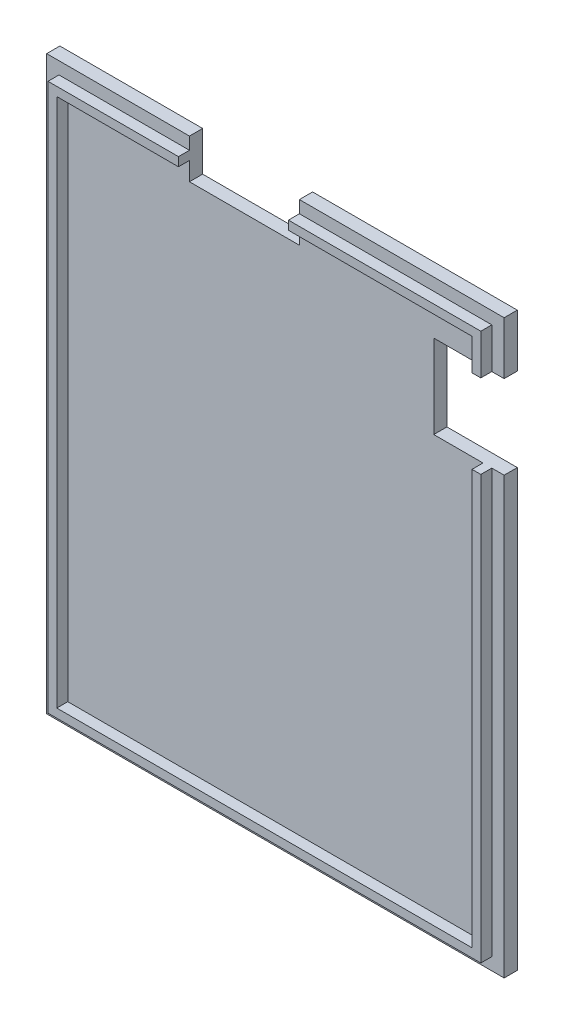
ISO-10303-21;
HEADER;
FILE_DESCRIPTION(('STEP AP214'),'2;1');
FILE_NAME('part.step','',(''),(''),'','','');
FILE_SCHEMA(('AUTOMOTIVE_DESIGN { 1 0 10303 214 1 1 1 1 }'));
ENDSEC;
DATA;
#1=APPLICATION_CONTEXT('core data for automotive mechanical design processes');
#2=APPLICATION_PROTOCOL_DEFINITION('international standard','automotive_design',2000,#1);
#3=PRODUCT_CONTEXT('',#1,'mechanical');
#4=PRODUCT('Part','Part','',(#3));
#5=PRODUCT_RELATED_PRODUCT_CATEGORY('part','',(#4));
#6=PRODUCT_DEFINITION_FORMATION('','',#4);
#7=PRODUCT_DEFINITION_CONTEXT('part definition',#1,'design');
#8=PRODUCT_DEFINITION('design','',#6,#7);
#9=PRODUCT_DEFINITION_SHAPE('','',#8);
#10=(LENGTH_UNIT() NAMED_UNIT(*) SI_UNIT(.MILLI.,.METRE.));
#11=(NAMED_UNIT(*) PLANE_ANGLE_UNIT() SI_UNIT($,.RADIAN.));
#12=(NAMED_UNIT(*) SI_UNIT($,.STERADIAN.) SOLID_ANGLE_UNIT());
#13=UNCERTAINTY_MEASURE_WITH_UNIT(LENGTH_MEASURE(1.E-05),#10,'distance_accuracy_value','');
#14=(GEOMETRIC_REPRESENTATION_CONTEXT(3) GLOBAL_UNCERTAINTY_ASSIGNED_CONTEXT((#13)) GLOBAL_UNIT_ASSIGNED_CONTEXT((#10,
#11,#12)) REPRESENTATION_CONTEXT('',''));
#15=CARTESIAN_POINT('',(0.,0.,0.));
#16=DIRECTION('',(0.,0.,1.));
#17=DIRECTION('',(1.,0.,0.));
#18=AXIS2_PLACEMENT_3D('',#15,#16,#17);
#19=CARTESIAN_POINT('',(0.,0.,3.));
#20=DIRECTION('',(0.,0.,1.));
#21=DIRECTION('',(1.,0.,0.));
#22=AXIS2_PLACEMENT_3D('',#19,#20,#21);
#23=PLANE('',#22);
#24=DIRECTION('',(-1.,0.,0.));
#25=VECTOR('',#24,1.);
#26=CARTESIAN_POINT('',(0.,53.,3.));
#27=LINE('',#26,#25);
#28=CARTESIAN_POINT('',(52.,53.,3.));
#29=VERTEX_POINT('',#28);
#30=CARTESIAN_POINT('',(49.2,53.,3.));
#31=VERTEX_POINT('',#30);
#32=EDGE_CURVE('E314',#29,#31,#27,.T.);
#33=ORIENTED_EDGE('',*,*,#32,.F.);
#34=DIRECTION('',(0.,1.,0.));
#35=VECTOR('',#34,1.);
#36=CARTESIAN_POINT('',(52.,65.,3.));
#37=LINE('',#36,#35);
#38=CARTESIAN_POINT('',(52.,65.,3.));
#39=VERTEX_POINT('',#38);
#40=EDGE_CURVE('E261',#29,#39,#37,.T.);
#41=ORIENTED_EDGE('',*,*,#40,.T.);
#42=DIRECTION('',(-1.,0.,0.));
#43=VECTOR('',#42,1.);
#44=CARTESIAN_POINT('',(-52.,65.,3.));
#45=LINE('',#44,#43);
#46=CARTESIAN_POINT('',(5.45881259509573,65.,3.));
#47=VERTEX_POINT('',#46);
#48=EDGE_CURVE('E389',#39,#47,#45,.T.);
#49=ORIENTED_EDGE('',*,*,#48,.T.);
#50=DIRECTION('',(0.,1.,0.));
#51=VECTOR('',#50,1.);
#52=CARTESIAN_POINT('',(5.45881259509572,0.,3.));
#53=LINE('',#52,#51);
#54=CARTESIAN_POINT('',(5.45881259509573,62.2,3.));
#55=VERTEX_POINT('',#54);
#56=EDGE_CURVE('E427',#55,#47,#53,.T.);
#57=ORIENTED_EDGE('',*,*,#56,.F.);
#58=DIRECTION('',(-1.,0.,0.));
#59=VECTOR('',#58,1.);
#60=CARTESIAN_POINT('',(0.,62.2,3.));
#61=LINE('',#60,#59);
#62=CARTESIAN_POINT('',(49.2,62.2,3.));
#63=VERTEX_POINT('',#62);
#64=EDGE_CURVE('E321',#63,#55,#61,.T.);
#65=ORIENTED_EDGE('',*,*,#64,.F.);
#66=DIRECTION('',(0.,1.,0.));
#67=VECTOR('',#66,1.);
#68=CARTESIAN_POINT('',(49.2,0.,3.));
#69=LINE('',#68,#67);
#70=EDGE_CURVE('E358',#31,#63,#69,.T.);
#71=ORIENTED_EDGE('',*,*,#70,.F.);
#72=EDGE_LOOP('',(#33,#41,#49,#57,#65,#71));
#73=FACE_BOUND('',#72,.T.);
#74=ADVANCED_FACE('F37',(#73),#23,.T.);
#75=CARTESIAN_POINT('',(52.,65.,3.));
#76=DIRECTION('',(-1.,0.,0.));
#77=DIRECTION('',(0.,-1.,0.));
#78=AXIS2_PLACEMENT_3D('',#75,#76,#77);
#79=PLANE('',#78);
#80=ORIENTED_EDGE('',*,*,#40,.F.);
#81=DIRECTION('',(0.,0.,-1.));
#82=VECTOR('',#81,1.);
#83=CARTESIAN_POINT('',(52.,53.,5.5));
#84=LINE('',#83,#82);
#85=CARTESIAN_POINT('',(52.,53.,0.));
#86=VERTEX_POINT('',#85);
#87=EDGE_CURVE('E424',#29,#86,#84,.T.);
#88=ORIENTED_EDGE('',*,*,#87,.T.);
#89=DIRECTION('',(0.,1.,0.));
#90=VECTOR('',#89,1.);
#91=CARTESIAN_POINT('',(52.,65.,0.));
#92=LINE('',#91,#90);
#93=CARTESIAN_POINT('',(52.,65.,0.));
#94=VERTEX_POINT('',#93);
#95=EDGE_CURVE('E247',#86,#94,#92,.T.);
#96=ORIENTED_EDGE('',*,*,#95,.T.);
#97=DIRECTION('',(0.,0.,-1.));
#98=VECTOR('',#97,1.);
#99=CARTESIAN_POINT('',(52.,65.,3.));
#100=LINE('',#99,#98);
#101=EDGE_CURVE('E269',#39,#94,#100,.T.);
#102=ORIENTED_EDGE('',*,*,#101,.F.);
#103=EDGE_LOOP('',(#80,#88,#96,#102));
#104=FACE_BOUND('',#103,.T.);
#105=ADVANCED_FACE('F500',(#104),#79,.F.);
#106=CARTESIAN_POINT('',(-52.,65.,3.));
#107=DIRECTION('',(0.,-1.,0.));
#108=DIRECTION('',(0.,0.,-1.));
#109=AXIS2_PLACEMENT_3D('',#106,#107,#108);
#110=PLANE('',#109);
#111=CARTESIAN_POINT('',(-19.5411874049043,65.,3.));
#112=VERTEX_POINT('',#111);
#113=CARTESIAN_POINT('',(-52.,65.,3.));
#114=VERTEX_POINT('',#113);
#115=EDGE_CURVE('E388',#112,#114,#45,.T.);
#116=ORIENTED_EDGE('',*,*,#115,.F.);
#117=DIRECTION('',(0.,0.,-1.));
#118=VECTOR('',#117,1.);
#119=CARTESIAN_POINT('',(-19.5411874049043,65.,5.5));
#120=LINE('',#119,#118);
#121=CARTESIAN_POINT('',(-19.5411874049043,65.,0.));
#122=VERTEX_POINT('',#121);
#123=EDGE_CURVE('E409',#112,#122,#120,.T.);
#124=ORIENTED_EDGE('',*,*,#123,.T.);
#125=DIRECTION('',(-1.,0.,0.));
#126=VECTOR('',#125,1.);
#127=CARTESIAN_POINT('',(-52.,65.,0.));
#128=LINE('',#127,#126);
#129=CARTESIAN_POINT('',(-52.,65.,0.));
#130=VERTEX_POINT('',#129);
#131=EDGE_CURVE('E246',#122,#130,#128,.T.);
#132=ORIENTED_EDGE('',*,*,#131,.T.);
#133=DIRECTION('',(0.,0.,-1.));
#134=VECTOR('',#133,1.);
#135=CARTESIAN_POINT('',(-52.,65.,3.));
#136=LINE('',#135,#134);
#137=EDGE_CURVE('E266',#114,#130,#136,.T.);
#138=ORIENTED_EDGE('',*,*,#137,.F.);
#139=EDGE_LOOP('',(#116,#124,#132,#138));
#140=FACE_BOUND('',#139,.T.);
#141=ADVANCED_FACE('F407',(#140),#110,.F.);
#142=CARTESIAN_POINT('',(49.2,0.,5.5));
#143=DIRECTION('',(-1.,0.,0.));
#144=DIRECTION('',(0.,-1.,0.));
#145=AXIS2_PLACEMENT_3D('',#142,#143,#144);
#146=PLANE('',#145);
#147=DIRECTION('',(0.,1.,0.));
#148=VECTOR('',#147,1.);
#149=CARTESIAN_POINT('',(49.2,0.,5.5));
#150=LINE('',#149,#148);
#151=CARTESIAN_POINT('',(49.2,53.,5.5));
#152=VERTEX_POINT('',#151);
#153=CARTESIAN_POINT('',(49.2,62.2,5.5));
#154=VERTEX_POINT('',#153);
#155=EDGE_CURVE('E335',#152,#154,#150,.T.);
#156=ORIENTED_EDGE('',*,*,#155,.F.);
#157=DIRECTION('',(0.,0.,-1.));
#158=VECTOR('',#157,1.);
#159=CARTESIAN_POINT('',(49.2,53.,5.5));
#160=LINE('',#159,#158);
#161=EDGE_CURVE('E311',#152,#31,#160,.T.);
#162=ORIENTED_EDGE('',*,*,#161,.T.);
#163=ORIENTED_EDGE('',*,*,#70,.T.);
#164=DIRECTION('',(0.,0.,-1.));
#165=VECTOR('',#164,1.);
#166=CARTESIAN_POINT('',(49.2,62.2,5.5));
#167=LINE('',#166,#165);
#168=EDGE_CURVE('E368',#154,#63,#167,.T.);
#169=ORIENTED_EDGE('',*,*,#168,.F.);
#170=EDGE_LOOP('',(#156,#162,#163,#169));
#171=FACE_BOUND('',#170,.T.);
#172=ADVANCED_FACE('F523',(#171),#146,.F.);
#173=CARTESIAN_POINT('',(0.,60.2,5.5));
#174=DIRECTION('',(0.,-1.,0.));
#175=DIRECTION('',(0.,0.,-1.));
#176=AXIS2_PLACEMENT_3D('',#173,#174,#175);
#177=PLANE('',#176);
#178=DIRECTION('',(0.,0.,-1.));
#179=VECTOR('',#178,1.);
#180=CARTESIAN_POINT('',(-19.5411874049043,60.2,5.5));
#181=LINE('',#180,#179);
#182=CARTESIAN_POINT('',(-19.5411874049043,60.2,5.5));
#183=VERTEX_POINT('',#182);
#184=CARTESIAN_POINT('',(-19.5411874049043,60.2,3.));
#185=VERTEX_POINT('',#184);
#186=EDGE_CURVE('E429',#183,#185,#181,.T.);
#187=ORIENTED_EDGE('',*,*,#186,.F.);
#188=DIRECTION('',(-1.,0.,0.));
#189=VECTOR('',#188,1.);
#190=CARTESIAN_POINT('',(0.,60.2,5.5));
#191=LINE('',#190,#189);
#192=CARTESIAN_POINT('',(-47.2,60.2,5.5));
#193=VERTEX_POINT('',#192);
#194=EDGE_CURVE('E324',#183,#193,#191,.T.);
#195=ORIENTED_EDGE('',*,*,#194,.T.);
#196=DIRECTION('',(0.,0.,-1.));
#197=VECTOR('',#196,1.);
#198=CARTESIAN_POINT('',(-47.2,60.2,5.5));
#199=LINE('',#198,#197);
#200=CARTESIAN_POINT('',(-47.2,60.2,3.));
#201=VERTEX_POINT('',#200);
#202=EDGE_CURVE('E381',#193,#201,#199,.T.);
#203=ORIENTED_EDGE('',*,*,#202,.T.);
#204=DIRECTION('',(-1.,0.,0.));
#205=VECTOR('',#204,1.);
#206=CARTESIAN_POINT('',(0.,60.2,3.));
#207=LINE('',#206,#205);
#208=EDGE_CURVE('E347',#185,#201,#207,.T.);
#209=ORIENTED_EDGE('',*,*,#208,.F.);
#210=EDGE_LOOP('',(#187,#195,#203,#209));
#211=FACE_BOUND('',#210,.T.);
#212=ADVANCED_FACE('F552',(#211),#177,.T.);
#213=CARTESIAN_POINT('',(47.2,0.,5.5));
#214=DIRECTION('',(-1.,0.,0.));
#215=DIRECTION('',(0.,0.,1.));
#216=AXIS2_PLACEMENT_3D('',#213,#214,#215);
#217=PLANE('',#216);
#218=DIRECTION('',(0.,0.,-1.));
#219=VECTOR('',#218,1.);
#220=CARTESIAN_POINT('',(47.2,53.,5.5));
#221=LINE('',#220,#219);
#222=CARTESIAN_POINT('',(47.2,53.,5.5));
#223=VERTEX_POINT('',#222);
#224=CARTESIAN_POINT('',(47.2,53.,3.));
#225=VERTEX_POINT('',#224);
#226=EDGE_CURVE('E309',#223,#225,#221,.T.);
#227=ORIENTED_EDGE('',*,*,#226,.F.);
#228=DIRECTION('',(0.,1.,0.));
#229=VECTOR('',#228,1.);
#230=CARTESIAN_POINT('',(47.2,0.,5.5));
#231=LINE('',#230,#229);
#232=CARTESIAN_POINT('',(47.2,60.2,5.5));
#233=VERTEX_POINT('',#232);
#234=EDGE_CURVE('E328',#223,#233,#231,.T.);
#235=ORIENTED_EDGE('',*,*,#234,.T.);
#236=DIRECTION('',(0.,0.,-1.));
#237=VECTOR('',#236,1.);
#238=CARTESIAN_POINT('',(47.2,60.2,5.5));
#239=LINE('',#238,#237);
#240=CARTESIAN_POINT('',(47.2,60.2,3.));
#241=VERTEX_POINT('',#240);
#242=EDGE_CURVE('E378',#233,#241,#239,.T.);
#243=ORIENTED_EDGE('',*,*,#242,.T.);
#244=DIRECTION('',(0.,1.,0.));
#245=VECTOR('',#244,1.);
#246=CARTESIAN_POINT('',(47.2,0.,3.));
#247=LINE('',#246,#245);
#248=EDGE_CURVE('E351',#225,#241,#247,.T.);
#249=ORIENTED_EDGE('',*,*,#248,.F.);
#250=EDGE_LOOP('',(#227,#235,#243,#249));
#251=FACE_BOUND('',#250,.T.);
#252=ADVANCED_FACE('F548',(#251),#217,.T.);
#253=CARTESIAN_POINT('',(0.,62.2,5.5));
#254=DIRECTION('',(0.,-1.,0.));
#255=DIRECTION('',(0.,0.,-1.));
#256=AXIS2_PLACEMENT_3D('',#253,#254,#255);
#257=PLANE('',#256);
#258=DIRECTION('',(-1.,0.,0.));
#259=VECTOR('',#258,1.);
#260=CARTESIAN_POINT('',(0.,62.2,5.5));
#261=LINE('',#260,#259);
#262=CARTESIAN_POINT('',(-19.5411874049043,62.2,5.5));
#263=VERTEX_POINT('',#262);
#264=CARTESIAN_POINT('',(-49.2,62.2,5.5));
#265=VERTEX_POINT('',#264);
#266=EDGE_CURVE('E339',#263,#265,#261,.T.);
#267=ORIENTED_EDGE('',*,*,#266,.F.);
#268=DIRECTION('',(0.,0.,-1.));
#269=VECTOR('',#268,1.);
#270=CARTESIAN_POINT('',(-19.5411874049043,62.2,5.5));
#271=LINE('',#270,#269);
#272=CARTESIAN_POINT('',(-19.5411874049043,62.2,3.));
#273=VERTEX_POINT('',#272);
#274=EDGE_CURVE('E304',#263,#273,#271,.T.);
#275=ORIENTED_EDGE('',*,*,#274,.T.);
#276=CARTESIAN_POINT('',(-49.2,62.2,3.));
#277=VERTEX_POINT('',#276);
#278=EDGE_CURVE('E362',#273,#277,#61,.T.);
#279=ORIENTED_EDGE('',*,*,#278,.T.);
#280=DIRECTION('',(0.,0.,-1.));
#281=VECTOR('',#280,1.);
#282=CARTESIAN_POINT('',(-49.2,62.2,5.5));
#283=LINE('',#282,#281);
#284=EDGE_CURVE('E365',#265,#277,#283,.T.);
#285=ORIENTED_EDGE('',*,*,#284,.F.);
#286=EDGE_LOOP('',(#267,#275,#279,#285));
#287=FACE_BOUND('',#286,.T.);
#288=ADVANCED_FACE('F434',(#287),#257,.F.);
#289=CARTESIAN_POINT('',(0.,0.,5.5));
#290=DIRECTION('',(0.,0.,1.));
#291=DIRECTION('',(1.,0.,0.));
#292=AXIS2_PLACEMENT_3D('',#289,#290,#291);
#293=PLANE('',#292);
#294=DIRECTION('',(1.,0.,0.));
#295=VECTOR('',#294,1.);
#296=CARTESIAN_POINT('',(52.,53.,5.5));
#297=LINE('',#296,#295);
#298=EDGE_CURVE('E230',#223,#152,#297,.T.);
#299=ORIENTED_EDGE('',*,*,#298,.T.);
#300=ORIENTED_EDGE('',*,*,#155,.T.);
#301=CARTESIAN_POINT('',(5.45881259509573,62.2,5.5));
#302=VERTEX_POINT('',#301);
#303=EDGE_CURVE('E340',#154,#302,#261,.T.);
#304=ORIENTED_EDGE('',*,*,#303,.T.);
#305=DIRECTION('',(0.,-1.,0.));
#306=VECTOR('',#305,1.);
#307=CARTESIAN_POINT('',(5.45881259509573,65.,5.5));
#308=LINE('',#307,#306);
#309=CARTESIAN_POINT('',(5.45881259509573,60.2,5.5));
#310=VERTEX_POINT('',#309);
#311=EDGE_CURVE('E413',#302,#310,#308,.T.);
#312=ORIENTED_EDGE('',*,*,#311,.T.);
#313=EDGE_CURVE('E325',#233,#310,#191,.T.);
#314=ORIENTED_EDGE('',*,*,#313,.F.);
#315=ORIENTED_EDGE('',*,*,#234,.F.);
#316=EDGE_LOOP('',(#299,#300,#304,#312,#314,#315));
#317=FACE_BOUND('',#316,.T.);
#318=ADVANCED_FACE('F482',(#317),#293,.T.);
#319=DIRECTION('',(1.,0.,0.));
#320=VECTOR('',#319,1.);
#321=CARTESIAN_POINT('',(0.,34.,3.));
#322=LINE('',#321,#320);
#323=CARTESIAN_POINT('',(49.2,34.,3.));
#324=VERTEX_POINT('',#323);
#325=CARTESIAN_POINT('',(52.,34.,3.));
#326=VERTEX_POINT('',#325);
#327=EDGE_CURVE('E225',#324,#326,#322,.T.);
#328=ORIENTED_EDGE('',*,*,#327,.F.);
#329=CARTESIAN_POINT('',(49.2,-62.2,3.));
#330=VERTEX_POINT('',#329);
#331=EDGE_CURVE('E359',#330,#324,#69,.T.);
#332=ORIENTED_EDGE('',*,*,#331,.F.);
#333=DIRECTION('',(1.,0.,0.));
#334=VECTOR('',#333,1.);
#335=CARTESIAN_POINT('',(0.,-62.2,3.));
#336=LINE('',#335,#334);
#337=CARTESIAN_POINT('',(-49.2,-62.2,3.));
#338=VERTEX_POINT('',#337);
#339=EDGE_CURVE('E356',#338,#330,#336,.T.);
#340=ORIENTED_EDGE('',*,*,#339,.F.);
#341=DIRECTION('',(0.,-1.,0.));
#342=VECTOR('',#341,1.);
#343=CARTESIAN_POINT('',(-49.2,0.,3.));
#344=LINE('',#343,#342);
#345=EDGE_CURVE('E353',#277,#338,#344,.T.);
#346=ORIENTED_EDGE('',*,*,#345,.F.);
#347=ORIENTED_EDGE('',*,*,#278,.F.);
#348=DIRECTION('',(0.,-1.,0.));
#349=VECTOR('',#348,1.);
#350=CARTESIAN_POINT('',(-19.5411874049043,0.,3.));
#351=LINE('',#350,#349);
#352=EDGE_CURVE('E300',#112,#273,#351,.T.);
#353=ORIENTED_EDGE('',*,*,#352,.F.);
#354=ORIENTED_EDGE('',*,*,#115,.T.);
#355=DIRECTION('',(0.,-1.,0.));
#356=VECTOR('',#355,1.);
#357=CARTESIAN_POINT('',(-52.,65.,3.));
#358=LINE('',#357,#356);
#359=CARTESIAN_POINT('',(-52.,-65.,3.));
#360=VERTEX_POINT('',#359);
#361=EDGE_CURVE('E391',#114,#360,#358,.T.);
#362=ORIENTED_EDGE('',*,*,#361,.T.);
#363=DIRECTION('',(1.,0.,0.));
#364=VECTOR('',#363,1.);
#365=CARTESIAN_POINT('',(-52.,-65.,3.));
#366=LINE('',#365,#364);
#367=CARTESIAN_POINT('',(52.,-65.,3.));
#368=VERTEX_POINT('',#367);
#369=EDGE_CURVE('E253',#360,#368,#366,.T.);
#370=ORIENTED_EDGE('',*,*,#369,.T.);
#371=EDGE_CURVE('E386',#368,#326,#37,.T.);
#372=ORIENTED_EDGE('',*,*,#371,.T.);
#373=EDGE_LOOP('',(#328,#332,#340,#346,#347,#353,#354,#362,#370,#372));
#374=FACE_BOUND('',#373,.T.);
#375=ADVANCED_FACE('F396',(#374),#23,.T.);
#376=CARTESIAN_POINT('',(52.,-65.,0.));
#377=VERTEX_POINT('',#376);
#378=CARTESIAN_POINT('',(52.,34.,0.));
#379=VERTEX_POINT('',#378);
#380=EDGE_CURVE('E237',#377,#379,#92,.T.);
#381=ORIENTED_EDGE('',*,*,#380,.T.);
#382=DIRECTION('',(0.,0.,-1.));
#383=VECTOR('',#382,1.);
#384=CARTESIAN_POINT('',(52.,34.,5.5));
#385=LINE('',#384,#383);
#386=EDGE_CURVE('E219',#326,#379,#385,.T.);
#387=ORIENTED_EDGE('',*,*,#386,.F.);
#388=ORIENTED_EDGE('',*,*,#371,.F.);
#389=DIRECTION('',(0.,0.,-1.));
#390=VECTOR('',#389,1.);
#391=CARTESIAN_POINT('',(52.,-65.,3.));
#392=LINE('',#391,#390);
#393=EDGE_CURVE('E245',#368,#377,#392,.T.);
#394=ORIENTED_EDGE('',*,*,#393,.T.);
#395=EDGE_LOOP('',(#381,#387,#388,#394));
#396=FACE_BOUND('',#395,.T.);
#397=ADVANCED_FACE('F39',(#396),#79,.F.);
#398=CARTESIAN_POINT('',(5.45881259509573,65.,0.));
#399=VERTEX_POINT('',#398);
#400=EDGE_CURVE('E249',#94,#399,#128,.T.);
#401=ORIENTED_EDGE('',*,*,#400,.T.);
#402=DIRECTION('',(0.,0.,-1.));
#403=VECTOR('',#402,1.);
#404=CARTESIAN_POINT('',(5.45881259509573,65.,5.5));
#405=LINE('',#404,#403);
#406=EDGE_CURVE('E412',#47,#399,#405,.T.);
#407=ORIENTED_EDGE('',*,*,#406,.F.);
#408=ORIENTED_EDGE('',*,*,#48,.F.);
#409=ORIENTED_EDGE('',*,*,#101,.T.);
#410=EDGE_LOOP('',(#401,#407,#408,#409));
#411=FACE_BOUND('',#410,.T.);
#412=ADVANCED_FACE('F494',(#411),#110,.F.);
#413=CARTESIAN_POINT('',(-52.,65.,3.));
#414=DIRECTION('',(1.,0.,0.));
#415=DIRECTION('',(0.,1.,0.));
#416=AXIS2_PLACEMENT_3D('',#413,#414,#415);
#417=PLANE('',#416);
#418=DIRECTION('',(0.,-1.,0.));
#419=VECTOR('',#418,1.);
#420=CARTESIAN_POINT('',(-52.,65.,0.));
#421=LINE('',#420,#419);
#422=CARTESIAN_POINT('',(-52.,-65.,0.));
#423=VERTEX_POINT('',#422);
#424=EDGE_CURVE('E257',#130,#423,#421,.T.);
#425=ORIENTED_EDGE('',*,*,#424,.T.);
#426=DIRECTION('',(0.,0.,-1.));
#427=VECTOR('',#426,1.);
#428=CARTESIAN_POINT('',(-52.,-65.,3.));
#429=LINE('',#428,#427);
#430=EDGE_CURVE('E263',#360,#423,#429,.T.);
#431=ORIENTED_EDGE('',*,*,#430,.F.);
#432=ORIENTED_EDGE('',*,*,#361,.F.);
#433=ORIENTED_EDGE('',*,*,#137,.T.);
#434=EDGE_LOOP('',(#425,#431,#432,#433));
#435=FACE_BOUND('',#434,.T.);
#436=ADVANCED_FACE('F403',(#435),#417,.F.);
#437=CARTESIAN_POINT('',(-52.,-65.,3.));
#438=DIRECTION('',(0.,1.,0.));
#439=DIRECTION('',(0.,0.,1.));
#440=AXIS2_PLACEMENT_3D('',#437,#438,#439);
#441=PLANE('',#440);
#442=DIRECTION('',(1.,0.,0.));
#443=VECTOR('',#442,1.);
#444=CARTESIAN_POINT('',(-52.,-65.,0.));
#445=LINE('',#444,#443);
#446=EDGE_CURVE('E259',#423,#377,#445,.T.);
#447=ORIENTED_EDGE('',*,*,#446,.T.);
#448=ORIENTED_EDGE('',*,*,#393,.F.);
#449=ORIENTED_EDGE('',*,*,#369,.F.);
#450=ORIENTED_EDGE('',*,*,#430,.T.);
#451=EDGE_LOOP('',(#447,#448,#449,#450));
#452=FACE_BOUND('',#451,.T.);
#453=ADVANCED_FACE('F398',(#452),#441,.F.);
#454=CARTESIAN_POINT('',(0.,0.,0.));
#455=DIRECTION('',(0.,0.,1.));
#456=DIRECTION('',(1.,0.,0.));
#457=AXIS2_PLACEMENT_3D('',#454,#455,#456);
#458=PLANE('',#457);
#459=ORIENTED_EDGE('',*,*,#95,.F.);
#460=DIRECTION('',(1.,0.,0.));
#461=VECTOR('',#460,1.);
#462=CARTESIAN_POINT('',(52.,53.,0.));
#463=LINE('',#462,#461);
#464=CARTESIAN_POINT('',(36.,53.,0.));
#465=VERTEX_POINT('',#464);
#466=EDGE_CURVE('E496',#465,#86,#463,.T.);
#467=ORIENTED_EDGE('',*,*,#466,.F.);
#468=DIRECTION('',(0.,1.,0.));
#469=VECTOR('',#468,1.);
#470=CARTESIAN_POINT('',(36.,53.,0.));
#471=LINE('',#470,#469);
#472=CARTESIAN_POINT('',(36.,34.,0.));
#473=VERTEX_POINT('',#472);
#474=EDGE_CURVE('E240',#473,#465,#471,.T.);
#475=ORIENTED_EDGE('',*,*,#474,.F.);
#476=DIRECTION('',(-1.,0.,0.));
#477=VECTOR('',#476,1.);
#478=CARTESIAN_POINT('',(52.,34.,0.));
#479=LINE('',#478,#477);
#480=EDGE_CURVE('E222',#379,#473,#479,.T.);
#481=ORIENTED_EDGE('',*,*,#480,.F.);
#482=ORIENTED_EDGE('',*,*,#380,.F.);
#483=ORIENTED_EDGE('',*,*,#446,.F.);
#484=ORIENTED_EDGE('',*,*,#424,.F.);
#485=ORIENTED_EDGE('',*,*,#131,.F.);
#486=DIRECTION('',(0.,1.,0.));
#487=VECTOR('',#486,1.);
#488=CARTESIAN_POINT('',(-19.5411874049043,65.,0.));
#489=LINE('',#488,#487);
#490=CARTESIAN_POINT('',(-19.5411874049043,56.,0.));
#491=VERTEX_POINT('',#490);
#492=EDGE_CURVE('E457',#491,#122,#489,.T.);
#493=ORIENTED_EDGE('',*,*,#492,.F.);
#494=DIRECTION('',(-1.,0.,0.));
#495=VECTOR('',#494,1.);
#496=CARTESIAN_POINT('',(5.45881259509573,56.,0.));
#497=LINE('',#496,#495);
#498=CARTESIAN_POINT('',(5.45881259509573,56.,0.));
#499=VERTEX_POINT('',#498);
#500=EDGE_CURVE('E450',#499,#491,#497,.T.);
#501=ORIENTED_EDGE('',*,*,#500,.F.);
#502=DIRECTION('',(0.,-1.,0.));
#503=VECTOR('',#502,1.);
#504=CARTESIAN_POINT('',(5.45881259509573,65.,0.));
#505=LINE('',#504,#503);
#506=EDGE_CURVE('E453',#399,#499,#505,.T.);
#507=ORIENTED_EDGE('',*,*,#506,.F.);
#508=ORIENTED_EDGE('',*,*,#400,.F.);
#509=EDGE_LOOP('',(#459,#467,#475,#481,#482,#483,#484,#485,#493,#501,#507,#508));
#510=FACE_BOUND('',#509,.T.);
#511=ADVANCED_FACE('F235',(#510),#458,.F.);
#512=CARTESIAN_POINT('',(-49.2,0.,5.5));
#513=DIRECTION('',(1.,0.,0.));
#514=DIRECTION('',(0.,1.,0.));
#515=AXIS2_PLACEMENT_3D('',#512,#513,#514);
#516=PLANE('',#515);
#517=ORIENTED_EDGE('',*,*,#345,.T.);
#518=DIRECTION('',(0.,0.,-1.));
#519=VECTOR('',#518,1.);
#520=CARTESIAN_POINT('',(-49.2,-62.2,5.5));
#521=LINE('',#520,#519);
#522=CARTESIAN_POINT('',(-49.2,-62.2,5.5));
#523=VERTEX_POINT('',#522);
#524=EDGE_CURVE('E251',#523,#338,#521,.T.);
#525=ORIENTED_EDGE('',*,*,#524,.F.);
#526=DIRECTION('',(0.,-1.,0.));
#527=VECTOR('',#526,1.);
#528=CARTESIAN_POINT('',(-49.2,0.,5.5));
#529=LINE('',#528,#527);
#530=EDGE_CURVE('E330',#265,#523,#529,.T.);
#531=ORIENTED_EDGE('',*,*,#530,.F.);
#532=ORIENTED_EDGE('',*,*,#284,.T.);
#533=EDGE_LOOP('',(#517,#525,#531,#532));
#534=FACE_BOUND('',#533,.T.);
#535=ADVANCED_FACE('F442',(#534),#516,.F.);
#536=CARTESIAN_POINT('',(0.,-62.2,5.5));
#537=DIRECTION('',(0.,1.,0.));
#538=DIRECTION('',(0.,0.,1.));
#539=AXIS2_PLACEMENT_3D('',#536,#537,#538);
#540=PLANE('',#539);
#541=ORIENTED_EDGE('',*,*,#339,.T.);
#542=DIRECTION('',(0.,0.,-1.));
#543=VECTOR('',#542,1.);
#544=CARTESIAN_POINT('',(49.2,-62.2,5.5));
#545=LINE('',#544,#543);
#546=CARTESIAN_POINT('',(49.2,-62.2,5.5));
#547=VERTEX_POINT('',#546);
#548=EDGE_CURVE('E372',#547,#330,#545,.T.);
#549=ORIENTED_EDGE('',*,*,#548,.F.);
#550=DIRECTION('',(1.,0.,0.));
#551=VECTOR('',#550,1.);
#552=CARTESIAN_POINT('',(0.,-62.2,5.5));
#553=LINE('',#552,#551);
#554=EDGE_CURVE('E333',#523,#547,#553,.T.);
#555=ORIENTED_EDGE('',*,*,#554,.F.);
#556=ORIENTED_EDGE('',*,*,#524,.T.);
#557=EDGE_LOOP('',(#541,#549,#555,#556));
#558=FACE_BOUND('',#557,.T.);
#559=ADVANCED_FACE('F514',(#558),#540,.F.);
#560=ORIENTED_EDGE('',*,*,#331,.T.);
#561=DIRECTION('',(0.,0.,1.));
#562=VECTOR('',#561,1.);
#563=CARTESIAN_POINT('',(49.2,34.,5.5));
#564=LINE('',#563,#562);
#565=CARTESIAN_POINT('',(49.2,34.,5.5));
#566=VERTEX_POINT('',#565);
#567=EDGE_CURVE('E299',#324,#566,#564,.T.);
#568=ORIENTED_EDGE('',*,*,#567,.T.);
#569=EDGE_CURVE('E336',#547,#566,#150,.T.);
#570=ORIENTED_EDGE('',*,*,#569,.F.);
#571=ORIENTED_EDGE('',*,*,#548,.T.);
#572=EDGE_LOOP('',(#560,#568,#570,#571));
#573=FACE_BOUND('',#572,.T.);
#574=ADVANCED_FACE('F512',(#573),#146,.F.);
#575=CARTESIAN_POINT('',(0.,-60.2,5.5));
#576=DIRECTION('',(0.,1.,0.));
#577=DIRECTION('',(0.,0.,1.));
#578=AXIS2_PLACEMENT_3D('',#575,#576,#577);
#579=PLANE('',#578);
#580=DIRECTION('',(1.,0.,0.));
#581=VECTOR('',#580,1.);
#582=CARTESIAN_POINT('',(0.,-60.2,3.));
#583=LINE('',#582,#581);
#584=CARTESIAN_POINT('',(-47.2,-60.2,3.));
#585=VERTEX_POINT('',#584);
#586=CARTESIAN_POINT('',(47.2,-60.2,3.));
#587=VERTEX_POINT('',#586);
#588=EDGE_CURVE('E316',#585,#587,#583,.T.);
#589=ORIENTED_EDGE('',*,*,#588,.F.);
#590=DIRECTION('',(0.,0.,-1.));
#591=VECTOR('',#590,1.);
#592=CARTESIAN_POINT('',(-47.2,-60.2,5.5));
#593=LINE('',#592,#591);
#594=CARTESIAN_POINT('',(-47.2,-60.2,5.5));
#595=VERTEX_POINT('',#594);
#596=EDGE_CURVE('E369',#595,#585,#593,.T.);
#597=ORIENTED_EDGE('',*,*,#596,.F.);
#598=DIRECTION('',(1.,0.,0.));
#599=VECTOR('',#598,1.);
#600=CARTESIAN_POINT('',(0.,-60.2,5.5));
#601=LINE('',#600,#599);
#602=CARTESIAN_POINT('',(47.2,-60.2,5.5));
#603=VERTEX_POINT('',#602);
#604=EDGE_CURVE('E317',#595,#603,#601,.T.);
#605=ORIENTED_EDGE('',*,*,#604,.T.);
#606=DIRECTION('',(0.,0.,-1.));
#607=VECTOR('',#606,1.);
#608=CARTESIAN_POINT('',(47.2,-60.2,5.5));
#609=LINE('',#608,#607);
#610=EDGE_CURVE('E343',#603,#587,#609,.T.);
#611=ORIENTED_EDGE('',*,*,#610,.T.);
#612=EDGE_LOOP('',(#589,#597,#605,#611));
#613=FACE_BOUND('',#612,.T.);
#614=ADVANCED_FACE('F521',(#613),#579,.T.);
#615=CARTESIAN_POINT('',(-47.2,0.,5.5));
#616=DIRECTION('',(1.,0.,0.));
#617=DIRECTION('',(0.,0.,-1.));
#618=AXIS2_PLACEMENT_3D('',#615,#616,#617);
#619=PLANE('',#618);
#620=DIRECTION('',(0.,-1.,0.));
#621=VECTOR('',#620,1.);
#622=CARTESIAN_POINT('',(-47.2,0.,3.));
#623=LINE('',#622,#621);
#624=EDGE_CURVE('E345',#201,#585,#623,.T.);
#625=ORIENTED_EDGE('',*,*,#624,.F.);
#626=ORIENTED_EDGE('',*,*,#202,.F.);
#627=DIRECTION('',(0.,-1.,0.));
#628=VECTOR('',#627,1.);
#629=CARTESIAN_POINT('',(-47.2,0.,5.5));
#630=LINE('',#629,#628);
#631=EDGE_CURVE('E320',#193,#595,#630,.T.);
#632=ORIENTED_EDGE('',*,*,#631,.T.);
#633=ORIENTED_EDGE('',*,*,#596,.T.);
#634=EDGE_LOOP('',(#625,#626,#632,#633));
#635=FACE_BOUND('',#634,.T.);
#636=ADVANCED_FACE('F565',(#635),#619,.T.);
#637=DIRECTION('',(0.,0.,1.));
#638=VECTOR('',#637,1.);
#639=CARTESIAN_POINT('',(5.45881259509573,60.2,5.5));
#640=LINE('',#639,#638);
#641=CARTESIAN_POINT('',(5.45881259509573,60.2,3.));
#642=VERTEX_POINT('',#641);
#643=EDGE_CURVE('E421',#642,#310,#640,.T.);
#644=ORIENTED_EDGE('',*,*,#643,.F.);
#645=EDGE_CURVE('E348',#241,#642,#207,.T.);
#646=ORIENTED_EDGE('',*,*,#645,.F.);
#647=ORIENTED_EDGE('',*,*,#242,.F.);
#648=ORIENTED_EDGE('',*,*,#313,.T.);
#649=EDGE_LOOP('',(#644,#646,#647,#648));
#650=FACE_BOUND('',#649,.T.);
#651=ADVANCED_FACE('F476',(#650),#177,.T.);
#652=DIRECTION('',(0.,0.,1.));
#653=VECTOR('',#652,1.);
#654=CARTESIAN_POINT('',(47.2,34.,5.5));
#655=LINE('',#654,#653);
#656=CARTESIAN_POINT('',(47.2,34.,3.));
#657=VERTEX_POINT('',#656);
#658=CARTESIAN_POINT('',(47.2,34.,5.5));
#659=VERTEX_POINT('',#658);
#660=EDGE_CURVE('E292',#657,#659,#655,.T.);
#661=ORIENTED_EDGE('',*,*,#660,.F.);
#662=EDGE_CURVE('E290',#587,#657,#247,.T.);
#663=ORIENTED_EDGE('',*,*,#662,.F.);
#664=ORIENTED_EDGE('',*,*,#610,.F.);
#665=EDGE_CURVE('E298',#603,#659,#231,.T.);
#666=ORIENTED_EDGE('',*,*,#665,.T.);
#667=EDGE_LOOP('',(#661,#663,#664,#666));
#668=FACE_BOUND('',#667,.T.);
#669=ADVANCED_FACE('F296',(#668),#217,.T.);
#670=ORIENTED_EDGE('',*,*,#64,.T.);
#671=DIRECTION('',(0.,0.,1.));
#672=VECTOR('',#671,1.);
#673=CARTESIAN_POINT('',(5.45881259509573,62.2,5.5));
#674=LINE('',#673,#672);
#675=EDGE_CURVE('E423',#55,#302,#674,.T.);
#676=ORIENTED_EDGE('',*,*,#675,.T.);
#677=ORIENTED_EDGE('',*,*,#303,.F.);
#678=ORIENTED_EDGE('',*,*,#168,.T.);
#679=EDGE_LOOP('',(#670,#676,#677,#678));
#680=FACE_BOUND('',#679,.T.);
#681=ADVANCED_FACE('F486',(#680),#257,.F.);
#682=DIRECTION('',(-1.,0.,0.));
#683=VECTOR('',#682,1.);
#684=CARTESIAN_POINT('',(52.,34.,5.5));
#685=LINE('',#684,#683);
#686=EDGE_CURVE('E506',#566,#659,#685,.T.);
#687=ORIENTED_EDGE('',*,*,#686,.T.);
#688=ORIENTED_EDGE('',*,*,#665,.F.);
#689=ORIENTED_EDGE('',*,*,#604,.F.);
#690=ORIENTED_EDGE('',*,*,#631,.F.);
#691=ORIENTED_EDGE('',*,*,#194,.F.);
#692=DIRECTION('',(0.,1.,0.));
#693=VECTOR('',#692,1.);
#694=CARTESIAN_POINT('',(-19.5411874049043,65.,5.5));
#695=LINE('',#694,#693);
#696=EDGE_CURVE('E417',#183,#263,#695,.T.);
#697=ORIENTED_EDGE('',*,*,#696,.T.);
#698=ORIENTED_EDGE('',*,*,#266,.T.);
#699=ORIENTED_EDGE('',*,*,#530,.T.);
#700=ORIENTED_EDGE('',*,*,#554,.T.);
#701=ORIENTED_EDGE('',*,*,#569,.T.);
#702=EDGE_LOOP('',(#687,#688,#689,#690,#691,#697,#698,#699,#700,#701));
#703=FACE_BOUND('',#702,.T.);
#704=ADVANCED_FACE('F445',(#703),#293,.T.);
#705=DIRECTION('',(-1.,0.,0.));
#706=VECTOR('',#705,1.);
#707=CARTESIAN_POINT('',(0.,53.,3.));
#708=LINE('',#707,#706);
#709=CARTESIAN_POINT('',(36.,53.,3.));
#710=VERTEX_POINT('',#709);
#711=EDGE_CURVE('E11',#225,#710,#708,.T.);
#712=ORIENTED_EDGE('',*,*,#711,.F.);
#713=ORIENTED_EDGE('',*,*,#248,.T.);
#714=ORIENTED_EDGE('',*,*,#645,.T.);
#715=DIRECTION('',(0.,1.,0.));
#716=VECTOR('',#715,1.);
#717=CARTESIAN_POINT('',(5.45881259509572,0.,3.));
#718=LINE('',#717,#716);
#719=CARTESIAN_POINT('',(5.45881259509573,56.,3.));
#720=VERTEX_POINT('',#719);
#721=EDGE_CURVE('E272',#720,#642,#718,.T.);
#722=ORIENTED_EDGE('',*,*,#721,.F.);
#723=DIRECTION('',(1.,0.,0.));
#724=VECTOR('',#723,1.);
#725=CARTESIAN_POINT('',(0.,56.,3.));
#726=LINE('',#725,#724);
#727=CARTESIAN_POINT('',(-19.5411874049043,56.,3.));
#728=VERTEX_POINT('',#727);
#729=EDGE_CURVE('E274',#728,#720,#726,.T.);
#730=ORIENTED_EDGE('',*,*,#729,.F.);
#731=DIRECTION('',(0.,-1.,0.));
#732=VECTOR('',#731,1.);
#733=CARTESIAN_POINT('',(-19.5411874049043,0.,3.));
#734=LINE('',#733,#732);
#735=EDGE_CURVE('E276',#185,#728,#734,.T.);
#736=ORIENTED_EDGE('',*,*,#735,.F.);
#737=ORIENTED_EDGE('',*,*,#208,.T.);
#738=ORIENTED_EDGE('',*,*,#624,.T.);
#739=ORIENTED_EDGE('',*,*,#588,.T.);
#740=ORIENTED_EDGE('',*,*,#662,.T.);
#741=DIRECTION('',(1.,0.,0.));
#742=VECTOR('',#741,1.);
#743=CARTESIAN_POINT('',(0.,34.,3.));
#744=LINE('',#743,#742);
#745=CARTESIAN_POINT('',(36.,34.,3.));
#746=VERTEX_POINT('',#745);
#747=EDGE_CURVE('E278',#746,#657,#744,.T.);
#748=ORIENTED_EDGE('',*,*,#747,.F.);
#749=DIRECTION('',(0.,-1.,0.));
#750=VECTOR('',#749,1.);
#751=CARTESIAN_POINT('',(36.,0.,3.));
#752=LINE('',#751,#750);
#753=EDGE_CURVE('E45',#710,#746,#752,.T.);
#754=ORIENTED_EDGE('',*,*,#753,.F.);
#755=EDGE_LOOP('',(#712,#713,#714,#722,#730,#736,#737,#738,#739,#740,#748,#754));
#756=FACE_BOUND('',#755,.T.);
#757=ADVANCED_FACE('F288',(#756),#23,.T.);
#758=CARTESIAN_POINT('',(-19.5411874049043,65.,5.5));
#759=DIRECTION('',(-1.,0.,0.));
#760=DIRECTION('',(0.,-1.,0.));
#761=AXIS2_PLACEMENT_3D('',#758,#759,#760);
#762=PLANE('',#761);
#763=ORIENTED_EDGE('',*,*,#352,.T.);
#764=ORIENTED_EDGE('',*,*,#274,.F.);
#765=ORIENTED_EDGE('',*,*,#696,.F.);
#766=ORIENTED_EDGE('',*,*,#186,.T.);
#767=ORIENTED_EDGE('',*,*,#735,.T.);
#768=DIRECTION('',(0.,0.,-1.));
#769=VECTOR('',#768,1.);
#770=CARTESIAN_POINT('',(-19.5411874049043,56.,5.5));
#771=LINE('',#770,#769);
#772=EDGE_CURVE('E241',#728,#491,#771,.T.);
#773=ORIENTED_EDGE('',*,*,#772,.T.);
#774=ORIENTED_EDGE('',*,*,#492,.T.);
#775=ORIENTED_EDGE('',*,*,#123,.F.);
#776=EDGE_LOOP('',(#763,#764,#765,#766,#767,#773,#774,#775));
#777=FACE_BOUND('',#776,.T.);
#778=ADVANCED_FACE('F470',(#777),#762,.F.);
#779=CARTESIAN_POINT('',(5.45881259509573,56.,5.5));
#780=DIRECTION('',(0.,-1.,0.));
#781=DIRECTION('',(0.,0.,-1.));
#782=AXIS2_PLACEMENT_3D('',#779,#780,#781);
#783=PLANE('',#782);
#784=ORIENTED_EDGE('',*,*,#729,.T.);
#785=DIRECTION('',(0.,0.,-1.));
#786=VECTOR('',#785,1.);
#787=CARTESIAN_POINT('',(5.45881259509573,56.,5.5));
#788=LINE('',#787,#786);
#789=EDGE_CURVE('E60',#720,#499,#788,.T.);
#790=ORIENTED_EDGE('',*,*,#789,.T.);
#791=ORIENTED_EDGE('',*,*,#500,.T.);
#792=ORIENTED_EDGE('',*,*,#772,.F.);
#793=EDGE_LOOP('',(#784,#790,#791,#792));
#794=FACE_BOUND('',#793,.T.);
#795=ADVANCED_FACE('F461',(#794),#783,.F.);
#796=CARTESIAN_POINT('',(5.45881259509573,65.,5.5));
#797=DIRECTION('',(1.,0.,0.));
#798=DIRECTION('',(0.,1.,0.));
#799=AXIS2_PLACEMENT_3D('',#796,#797,#798);
#800=PLANE('',#799);
#801=ORIENTED_EDGE('',*,*,#56,.T.);
#802=ORIENTED_EDGE('',*,*,#406,.T.);
#803=ORIENTED_EDGE('',*,*,#506,.T.);
#804=ORIENTED_EDGE('',*,*,#789,.F.);
#805=ORIENTED_EDGE('',*,*,#721,.T.);
#806=ORIENTED_EDGE('',*,*,#643,.T.);
#807=ORIENTED_EDGE('',*,*,#311,.F.);
#808=ORIENTED_EDGE('',*,*,#675,.F.);
#809=EDGE_LOOP('',(#801,#802,#803,#804,#805,#806,#807,#808));
#810=FACE_BOUND('',#809,.T.);
#811=ADVANCED_FACE('F467',(#810),#800,.F.);
#812=CARTESIAN_POINT('',(52.,53.,5.5));
#813=DIRECTION('',(0.,1.,0.));
#814=DIRECTION('',(0.,0.,1.));
#815=AXIS2_PLACEMENT_3D('',#812,#813,#814);
#816=PLANE('',#815);
#817=ORIENTED_EDGE('',*,*,#32,.T.);
#818=ORIENTED_EDGE('',*,*,#161,.F.);
#819=ORIENTED_EDGE('',*,*,#298,.F.);
#820=ORIENTED_EDGE('',*,*,#226,.T.);
#821=ORIENTED_EDGE('',*,*,#711,.T.);
#822=DIRECTION('',(0.,0.,-1.));
#823=VECTOR('',#822,1.);
#824=CARTESIAN_POINT('',(36.,53.,5.5));
#825=LINE('',#824,#823);
#826=EDGE_CURVE('E284',#710,#465,#825,.T.);
#827=ORIENTED_EDGE('',*,*,#826,.T.);
#828=ORIENTED_EDGE('',*,*,#466,.T.);
#829=ORIENTED_EDGE('',*,*,#87,.F.);
#830=EDGE_LOOP('',(#817,#818,#819,#820,#821,#827,#828,#829));
#831=FACE_BOUND('',#830,.T.);
#832=ADVANCED_FACE('F709',(#831),#816,.F.);
#833=CARTESIAN_POINT('',(36.,53.,5.5));
#834=DIRECTION('',(-1.,0.,0.));
#835=DIRECTION('',(0.,0.,1.));
#836=AXIS2_PLACEMENT_3D('',#833,#834,#835);
#837=PLANE('',#836);
#838=ORIENTED_EDGE('',*,*,#753,.T.);
#839=DIRECTION('',(0.,0.,-1.));
#840=VECTOR('',#839,1.);
#841=CARTESIAN_POINT('',(36.,34.,5.5));
#842=LINE('',#841,#840);
#843=EDGE_CURVE('E52',#746,#473,#842,.T.);
#844=ORIENTED_EDGE('',*,*,#843,.T.);
#845=ORIENTED_EDGE('',*,*,#474,.T.);
#846=ORIENTED_EDGE('',*,*,#826,.F.);
#847=EDGE_LOOP('',(#838,#844,#845,#846));
#848=FACE_BOUND('',#847,.T.);
#849=ADVANCED_FACE('F283',(#848),#837,.F.);
#850=CARTESIAN_POINT('',(52.,34.,5.5));
#851=DIRECTION('',(0.,-1.,0.));
#852=DIRECTION('',(0.,0.,-1.));
#853=AXIS2_PLACEMENT_3D('',#850,#851,#852);
#854=PLANE('',#853);
#855=ORIENTED_EDGE('',*,*,#327,.T.);
#856=ORIENTED_EDGE('',*,*,#386,.T.);
#857=ORIENTED_EDGE('',*,*,#480,.T.);
#858=ORIENTED_EDGE('',*,*,#843,.F.);
#859=ORIENTED_EDGE('',*,*,#747,.T.);
#860=ORIENTED_EDGE('',*,*,#660,.T.);
#861=ORIENTED_EDGE('',*,*,#686,.F.);
#862=ORIENTED_EDGE('',*,*,#567,.F.);
#863=EDGE_LOOP('',(#855,#856,#857,#858,#859,#860,#861,#862));
#864=FACE_BOUND('',#863,.T.);
#865=ADVANCED_FACE('F221',(#864),#854,.F.);
#866=CLOSED_SHELL('',(#74,#105,#141,#172,#212,#252,#288,#318,#375,#397,#412,#436,#453,#511,#535,
#559,#574,#614,#636,#651,#669,#681,#704,#757,#778,#795,#811,#832,#849,#865));
#867=MANIFOLD_SOLID_BREP('B2',#866);
#868=ADVANCED_BREP_SHAPE_REPRESENTATION('',(#18,#867),#14);
#869=SHAPE_DEFINITION_REPRESENTATION(#9,#868);
ENDSEC;
END-ISO-10303-21;
